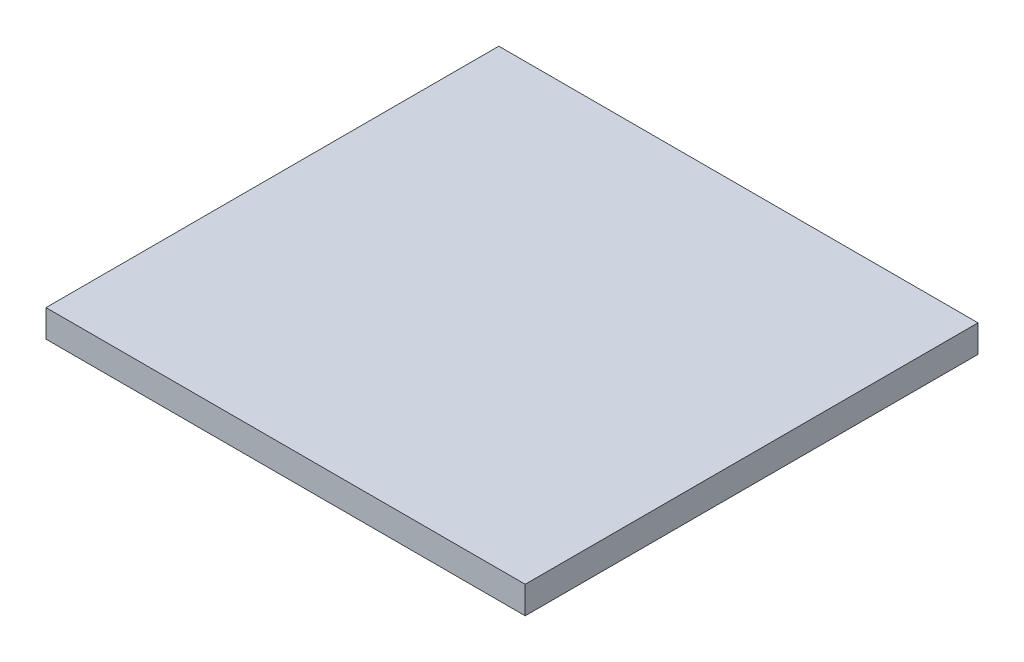
ISO-10303-21;
HEADER;
FILE_DESCRIPTION(('STEP AP214'),'2;1');
FILE_NAME('part.step','',(''),(''),'','','');
FILE_SCHEMA(('AUTOMOTIVE_DESIGN { 1 0 10303 214 1 1 1 1 }'));
ENDSEC;
DATA;
#1=APPLICATION_CONTEXT('core data for automotive mechanical design processes');
#2=APPLICATION_PROTOCOL_DEFINITION('international standard','automotive_design',2000,#1);
#3=PRODUCT_CONTEXT('',#1,'mechanical');
#4=PRODUCT('Part','Part','',(#3));
#5=PRODUCT_RELATED_PRODUCT_CATEGORY('part','',(#4));
#6=PRODUCT_DEFINITION_FORMATION('','',#4);
#7=PRODUCT_DEFINITION_CONTEXT('part definition',#1,'design');
#8=PRODUCT_DEFINITION('design','',#6,#7);
#9=PRODUCT_DEFINITION_SHAPE('','',#8);
#10=(LENGTH_UNIT() NAMED_UNIT(*) SI_UNIT(.MILLI.,.METRE.));
#11=(NAMED_UNIT(*) PLANE_ANGLE_UNIT() SI_UNIT($,.RADIAN.));
#12=(NAMED_UNIT(*) SI_UNIT($,.STERADIAN.) SOLID_ANGLE_UNIT());
#13=UNCERTAINTY_MEASURE_WITH_UNIT(LENGTH_MEASURE(1.E-05),#10,'distance_accuracy_value','');
#14=(GEOMETRIC_REPRESENTATION_CONTEXT(3) GLOBAL_UNCERTAINTY_ASSIGNED_CONTEXT((#13)) GLOBAL_UNIT_ASSIGNED_CONTEXT((#10,
#11,#12)) REPRESENTATION_CONTEXT('',''));
#15=CARTESIAN_POINT('',(0.,0.,0.));
#16=DIRECTION('',(0.,0.,1.));
#17=DIRECTION('',(1.,0.,0.));
#18=AXIS2_PLACEMENT_3D('',#15,#16,#17);
#19=CARTESIAN_POINT('',(-104.166289,11.8872,-98.425));
#20=DIRECTION('',(1.,0.,0.));
#21=DIRECTION('',(0.,0.,-1.));
#22=AXIS2_PLACEMENT_3D('',#19,#20,#21);
#23=PLANE('',#22);
#24=DIRECTION('',(0.,0.,1.));
#25=VECTOR('',#24,1.);
#26=CARTESIAN_POINT('',(-104.166289,0.,-98.425));
#27=LINE('',#26,#25);
#28=CARTESIAN_POINT('',(-104.166289,0.,-98.425));
#29=VERTEX_POINT('',#28);
#30=CARTESIAN_POINT('',(-104.166289,0.,98.425));
#31=VERTEX_POINT('',#30);
#32=EDGE_CURVE('E110',#29,#31,#27,.T.);
#33=ORIENTED_EDGE('',*,*,#32,.T.);
#34=DIRECTION('',(0.,-1.,0.));
#35=VECTOR('',#34,1.);
#36=CARTESIAN_POINT('',(-104.166289,11.8872,98.425));
#37=LINE('',#36,#35);
#38=CARTESIAN_POINT('',(-104.166289,11.8872,98.425));
#39=VERTEX_POINT('',#38);
#40=EDGE_CURVE('E11',#39,#31,#37,.T.);
#41=ORIENTED_EDGE('',*,*,#40,.F.);
#42=DIRECTION('',(0.,0.,1.));
#43=VECTOR('',#42,1.);
#44=CARTESIAN_POINT('',(-104.166289,11.8872,-98.425));
#45=LINE('',#44,#43);
#46=CARTESIAN_POINT('',(-104.166289,11.8872,-98.425));
#47=VERTEX_POINT('',#46);
#48=EDGE_CURVE('E93',#47,#39,#45,.T.);
#49=ORIENTED_EDGE('',*,*,#48,.F.);
#50=DIRECTION('',(0.,-1.,0.));
#51=VECTOR('',#50,1.);
#52=CARTESIAN_POINT('',(-104.166289,11.8872,-98.425));
#53=LINE('',#52,#51);
#54=EDGE_CURVE('E106',#47,#29,#53,.T.);
#55=ORIENTED_EDGE('',*,*,#54,.T.);
#56=EDGE_LOOP('',(#33,#41,#49,#55));
#57=FACE_BOUND('',#56,.T.);
#58=ADVANCED_FACE('F39',(#57),#23,.F.);
#59=CARTESIAN_POINT('',(104.166289,11.8872,98.425));
#60=DIRECTION('',(0.,0.,-1.));
#61=DIRECTION('',(-1.,0.,0.));
#62=AXIS2_PLACEMENT_3D('',#59,#60,#61);
#63=PLANE('',#62);
#64=DIRECTION('',(1.,0.,0.));
#65=VECTOR('',#64,1.);
#66=CARTESIAN_POINT('',(104.166289,0.,98.425));
#67=LINE('',#66,#65);
#68=CARTESIAN_POINT('',(104.166289,0.,98.425));
#69=VERTEX_POINT('',#68);
#70=EDGE_CURVE('E98',#31,#69,#67,.T.);
#71=ORIENTED_EDGE('',*,*,#70,.T.);
#72=DIRECTION('',(0.,-1.,0.));
#73=VECTOR('',#72,1.);
#74=CARTESIAN_POINT('',(104.166289,11.8872,98.425));
#75=LINE('',#74,#73);
#76=CARTESIAN_POINT('',(104.166289,11.8872,98.425));
#77=VERTEX_POINT('',#76);
#78=EDGE_CURVE('E47',#77,#69,#75,.T.);
#79=ORIENTED_EDGE('',*,*,#78,.F.);
#80=DIRECTION('',(1.,0.,0.));
#81=VECTOR('',#80,1.);
#82=CARTESIAN_POINT('',(104.166289,11.8872,98.425));
#83=LINE('',#82,#81);
#84=EDGE_CURVE('E87',#39,#77,#83,.T.);
#85=ORIENTED_EDGE('',*,*,#84,.F.);
#86=ORIENTED_EDGE('',*,*,#40,.T.);
#87=EDGE_LOOP('',(#71,#79,#85,#86));
#88=FACE_BOUND('',#87,.T.);
#89=ADVANCED_FACE('F97',(#88),#63,.F.);
#90=CARTESIAN_POINT('',(104.166289,11.8872,-98.425));
#91=DIRECTION('',(-1.,0.,0.));
#92=DIRECTION('',(0.,0.,1.));
#93=AXIS2_PLACEMENT_3D('',#90,#91,#92);
#94=PLANE('',#93);
#95=DIRECTION('',(0.,0.,-1.));
#96=VECTOR('',#95,1.);
#97=CARTESIAN_POINT('',(104.166289,0.,-98.425));
#98=LINE('',#97,#96);
#99=CARTESIAN_POINT('',(104.166289,0.,-98.425));
#100=VERTEX_POINT('',#99);
#101=EDGE_CURVE('E74',#69,#100,#98,.T.);
#102=ORIENTED_EDGE('',*,*,#101,.T.);
#103=DIRECTION('',(0.,-1.,0.));
#104=VECTOR('',#103,1.);
#105=CARTESIAN_POINT('',(104.166289,11.8872,-98.425));
#106=LINE('',#105,#104);
#107=CARTESIAN_POINT('',(104.166289,11.8872,-98.425));
#108=VERTEX_POINT('',#107);
#109=EDGE_CURVE('E100',#108,#100,#106,.T.);
#110=ORIENTED_EDGE('',*,*,#109,.F.);
#111=DIRECTION('',(0.,0.,-1.));
#112=VECTOR('',#111,1.);
#113=CARTESIAN_POINT('',(104.166289,11.8872,-98.425));
#114=LINE('',#113,#112);
#115=EDGE_CURVE('E91',#77,#108,#114,.T.);
#116=ORIENTED_EDGE('',*,*,#115,.F.);
#117=ORIENTED_EDGE('',*,*,#78,.T.);
#118=EDGE_LOOP('',(#102,#110,#116,#117));
#119=FACE_BOUND('',#118,.T.);
#120=ADVANCED_FACE('F101',(#119),#94,.F.);
#121=CARTESIAN_POINT('',(104.166289,11.8872,-98.425));
#122=DIRECTION('',(0.,0.,1.));
#123=DIRECTION('',(1.,0.,0.));
#124=AXIS2_PLACEMENT_3D('',#121,#122,#123);
#125=PLANE('',#124);
#126=DIRECTION('',(-1.,0.,0.));
#127=VECTOR('',#126,1.);
#128=CARTESIAN_POINT('',(104.166289,0.,-98.425));
#129=LINE('',#128,#127);
#130=EDGE_CURVE('E80',#100,#29,#129,.T.);
#131=ORIENTED_EDGE('',*,*,#130,.T.);
#132=ORIENTED_EDGE('',*,*,#54,.F.);
#133=DIRECTION('',(-1.,0.,0.));
#134=VECTOR('',#133,1.);
#135=CARTESIAN_POINT('',(104.166289,11.8872,-98.425));
#136=LINE('',#135,#134);
#137=EDGE_CURVE('E55',#108,#47,#136,.T.);
#138=ORIENTED_EDGE('',*,*,#137,.F.);
#139=ORIENTED_EDGE('',*,*,#109,.T.);
#140=EDGE_LOOP('',(#131,#132,#138,#139));
#141=FACE_BOUND('',#140,.T.);
#142=ADVANCED_FACE('F121',(#141),#125,.F.);
#143=CARTESIAN_POINT('',(0.,11.8872,0.));
#144=DIRECTION('',(0.,-1.,0.));
#145=DIRECTION('',(0.,0.,-1.));
#146=AXIS2_PLACEMENT_3D('',#143,#144,#145);
#147=PLANE('',#146);
#148=ORIENTED_EDGE('',*,*,#48,.T.);
#149=ORIENTED_EDGE('',*,*,#84,.T.);
#150=ORIENTED_EDGE('',*,*,#115,.T.);
#151=ORIENTED_EDGE('',*,*,#137,.T.);
#152=EDGE_LOOP('',(#148,#149,#150,#151));
#153=FACE_BOUND('',#152,.T.);
#154=ADVANCED_FACE('F89',(#153),#147,.F.);
#155=CARTESIAN_POINT('',(0.,0.,0.));
#156=DIRECTION('',(0.,-1.,0.));
#157=DIRECTION('',(0.,0.,-1.));
#158=AXIS2_PLACEMENT_3D('',#155,#156,#157);
#159=PLANE('',#158);
#160=ORIENTED_EDGE('',*,*,#32,.F.);
#161=ORIENTED_EDGE('',*,*,#130,.F.);
#162=ORIENTED_EDGE('',*,*,#101,.F.);
#163=ORIENTED_EDGE('',*,*,#70,.F.);
#164=EDGE_LOOP('',(#160,#161,#162,#163));
#165=FACE_BOUND('',#164,.T.);
#166=ADVANCED_FACE('F124',(#165),#159,.T.);
#167=CLOSED_SHELL('',(#58,#89,#120,#142,#154,#166));
#168=MANIFOLD_SOLID_BREP('B2',#167);
#169=ADVANCED_BREP_SHAPE_REPRESENTATION('',(#18,#168),#14);
#170=SHAPE_DEFINITION_REPRESENTATION(#9,#169);
ENDSEC;
END-ISO-10303-21;
